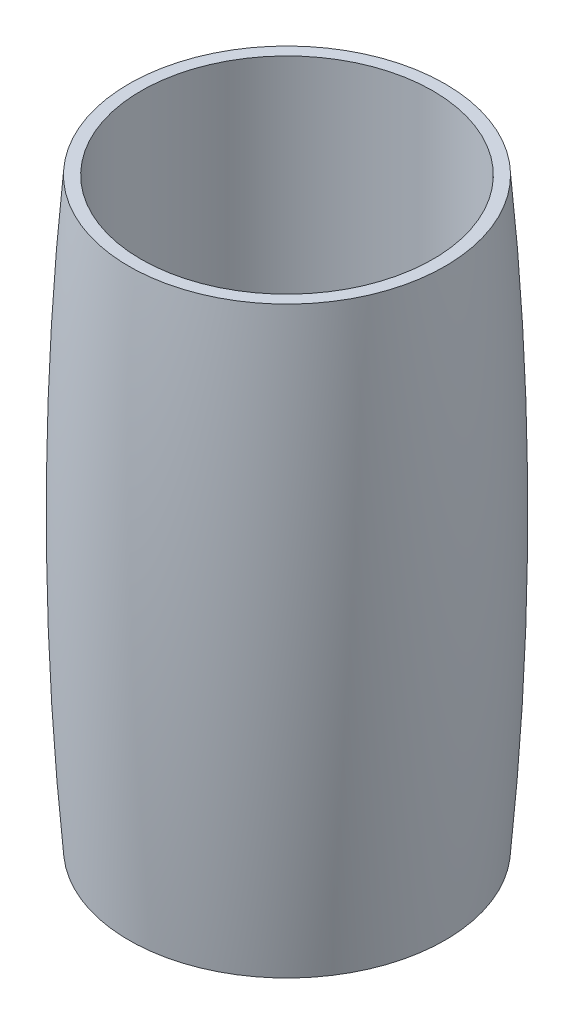
ISO-10303-21;
HEADER;
FILE_DESCRIPTION(('STEP AP214'),'2;1');
FILE_NAME('part.step','',(''),(''),'','','');
FILE_SCHEMA(('AUTOMOTIVE_DESIGN { 1 0 10303 214 1 1 1 1 }'));
ENDSEC;
DATA;
#1=APPLICATION_CONTEXT('core data for automotive mechanical design processes');
#2=APPLICATION_PROTOCOL_DEFINITION('international standard','automotive_design',2000,#1);
#3=PRODUCT_CONTEXT('',#1,'mechanical');
#4=PRODUCT('Part','Part','',(#3));
#5=PRODUCT_RELATED_PRODUCT_CATEGORY('part','',(#4));
#6=PRODUCT_DEFINITION_FORMATION('','',#4);
#7=PRODUCT_DEFINITION_CONTEXT('part definition',#1,'design');
#8=PRODUCT_DEFINITION('design','',#6,#7);
#9=PRODUCT_DEFINITION_SHAPE('','',#8);
#10=(LENGTH_UNIT() NAMED_UNIT(*) SI_UNIT(.MILLI.,.METRE.));
#11=(NAMED_UNIT(*) PLANE_ANGLE_UNIT() SI_UNIT($,.RADIAN.));
#12=(NAMED_UNIT(*) SI_UNIT($,.STERADIAN.) SOLID_ANGLE_UNIT());
#13=UNCERTAINTY_MEASURE_WITH_UNIT(LENGTH_MEASURE(1.E-05),#10,'distance_accuracy_value','');
#14=(GEOMETRIC_REPRESENTATION_CONTEXT(3) GLOBAL_UNCERTAINTY_ASSIGNED_CONTEXT((#13)) GLOBAL_UNIT_ASSIGNED_CONTEXT((#10,
#11,#12)) REPRESENTATION_CONTEXT('',''));
#15=CARTESIAN_POINT('',(0.,0.,0.));
#16=DIRECTION('',(0.,0.,1.));
#17=DIRECTION('',(1.,0.,0.));
#18=AXIS2_PLACEMENT_3D('',#15,#16,#17);
#19=CARTESIAN_POINT('',(38.1,152.4,0.));
#20=DIRECTION('',(0.,1.,0.));
#21=DIRECTION('',(0.,0.,1.));
#22=AXIS2_PLACEMENT_3D('',#19,#20,#21);
#23=PLANE('',#22);
#24=CARTESIAN_POINT('',(0.,152.4,0.));
#25=DIRECTION('',(0.,-1.,0.));
#26=DIRECTION('',(0.,0.,-1.));
#27=AXIS2_PLACEMENT_3D('',#24,#25,#26);
#28=CIRCLE('',#27,38.1);
#29=CARTESIAN_POINT('',(0.,152.4,-38.1));
#30=VERTEX_POINT('',#29);
#31=EDGE_CURVE('E10',#30,#30,#28,.T.);
#32=ORIENTED_EDGE('',*,*,#31,.T.);
#33=EDGE_LOOP('',(#32));
#34=FACE_BOUND('',#33,.T.);
#35=CARTESIAN_POINT('',(0.,152.4,0.));
#36=DIRECTION('',(0.,-1.,0.));
#37=DIRECTION('',(0.,0.,-1.));
#38=AXIS2_PLACEMENT_3D('',#35,#36,#37);
#39=CIRCLE('',#38,41.2749999999998);
#40=CARTESIAN_POINT('',(0.,152.4,-41.2749999999998));
#41=VERTEX_POINT('',#40);
#42=EDGE_CURVE('E45',#41,#41,#39,.T.);
#43=ORIENTED_EDGE('',*,*,#42,.F.);
#44=EDGE_LOOP('',(#43));
#45=FACE_BOUND('',#44,.T.);
#46=ADVANCED_FACE('F31',(#34,#45),#23,.T.);
#47=CARTESIAN_POINT('',(0.,0.,0.));
#48=DIRECTION('',(0.,-1.,0.));
#49=DIRECTION('',(0.,0.,-1.));
#50=AXIS2_PLACEMENT_3D('',#47,#48,#49);
#51=CYLINDRICAL_SURFACE('',#50,38.1);
#52=CARTESIAN_POINT('',(0.,0.,0.));
#53=DIRECTION('',(0.,-1.,0.));
#54=DIRECTION('',(0.,0.,-1.));
#55=AXIS2_PLACEMENT_3D('',#52,#53,#54);
#56=CIRCLE('',#55,38.1);
#57=CARTESIAN_POINT('',(0.,0.,-38.1));
#58=VERTEX_POINT('',#57);
#59=EDGE_CURVE('E37',#58,#58,#56,.T.);
#60=ORIENTED_EDGE('',*,*,#59,.T.);
#61=EDGE_LOOP('',(#60));
#62=FACE_BOUND('',#61,.T.);
#63=ORIENTED_EDGE('',*,*,#31,.F.);
#64=EDGE_LOOP('',(#63));
#65=FACE_BOUND('',#64,.T.);
#66=ADVANCED_FACE('F55',(#62,#65),#51,.F.);
#67=CARTESIAN_POINT('',(38.1,0.,0.));
#68=DIRECTION('',(0.,-1.,0.));
#69=DIRECTION('',(0.,0.,-1.));
#70=AXIS2_PLACEMENT_3D('',#67,#68,#69);
#71=PLANE('',#70);
#72=CARTESIAN_POINT('',(0.,0.,0.));
#73=DIRECTION('',(0.,-1.,0.));
#74=DIRECTION('',(0.,0.,-1.));
#75=AXIS2_PLACEMENT_3D('',#72,#73,#74);
#76=CIRCLE('',#75,41.275);
#77=CARTESIAN_POINT('',(0.,0.,-41.275));
#78=VERTEX_POINT('',#77);
#79=EDGE_CURVE('E41',#78,#78,#76,.T.);
#80=ORIENTED_EDGE('',*,*,#79,.T.);
#81=EDGE_LOOP('',(#80));
#82=FACE_BOUND('',#81,.T.);
#83=ORIENTED_EDGE('',*,*,#59,.F.);
#84=EDGE_LOOP('',(#83));
#85=FACE_BOUND('',#84,.T.);
#86=ADVANCED_FACE('F59',(#82,#85),#71,.T.);
#87=CARTESIAN_POINT('',(0.,76.1999999999998,0.));
#88=DIRECTION('',(0.,-1.,0.));
#89=DIRECTION('',(0.,0.,-1.));
#90=AXIS2_PLACEMENT_3D('',#87,#88,#89);
#91=DEGENERATE_TOROIDAL_SURFACE('',#90,871.537500000007,915.987500000007,.F.);
#92=ORIENTED_EDGE('',*,*,#42,.T.);
#93=EDGE_LOOP('',(#92));
#94=FACE_BOUND('',#93,.T.);
#95=ORIENTED_EDGE('',*,*,#79,.F.);
#96=EDGE_LOOP('',(#95));
#97=FACE_BOUND('',#96,.T.);
#98=ADVANCED_FACE('F51',(#94,#97),#91,.F.);
#99=CLOSED_SHELL('',(#46,#66,#86,#98));
#100=MANIFOLD_SOLID_BREP('B2',#99);
#101=ADVANCED_BREP_SHAPE_REPRESENTATION('',(#18,#100),#14);
#102=SHAPE_DEFINITION_REPRESENTATION(#9,#101);
ENDSEC;
END-ISO-10303-21;
